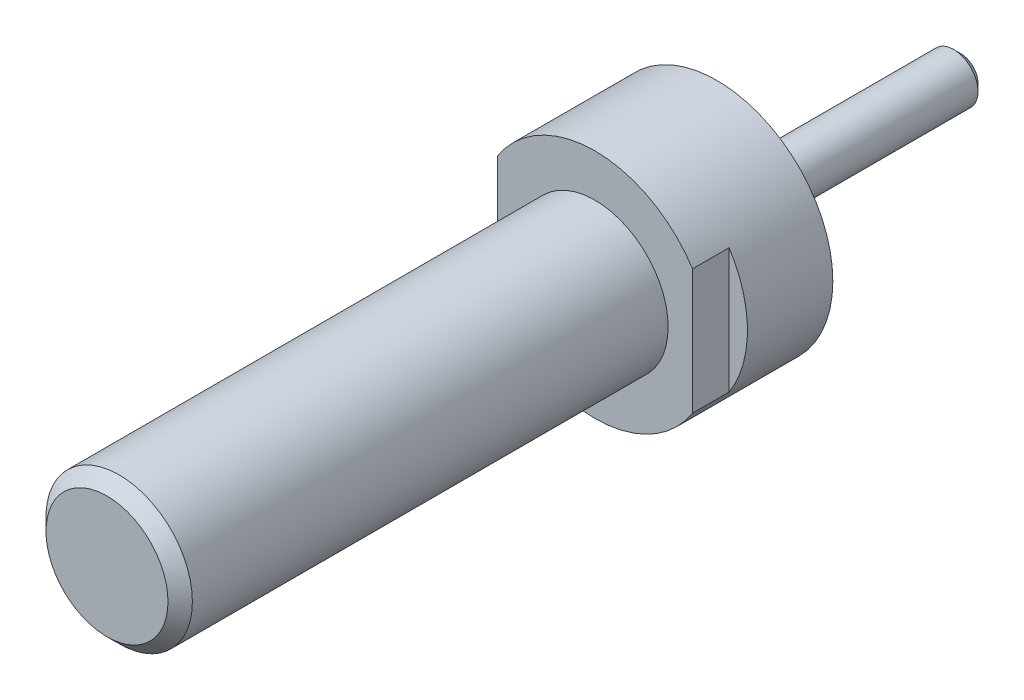
ISO-10303-21;
HEADER;
FILE_DESCRIPTION(('STEP AP214'),'2;1');
FILE_NAME('part.step','',(''),(''),'','','');
FILE_SCHEMA(('AUTOMOTIVE_DESIGN { 1 0 10303 214 1 1 1 1 }'));
ENDSEC;
DATA;
#1=APPLICATION_CONTEXT('core data for automotive mechanical design processes');
#2=APPLICATION_PROTOCOL_DEFINITION('international standard','automotive_design',2000,#1);
#3=PRODUCT_CONTEXT('',#1,'mechanical');
#4=PRODUCT('Part','Part','',(#3));
#5=PRODUCT_RELATED_PRODUCT_CATEGORY('part','',(#4));
#6=PRODUCT_DEFINITION_FORMATION('','',#4);
#7=PRODUCT_DEFINITION_CONTEXT('part definition',#1,'design');
#8=PRODUCT_DEFINITION('design','',#6,#7);
#9=PRODUCT_DEFINITION_SHAPE('','',#8);
#10=(LENGTH_UNIT() NAMED_UNIT(*) SI_UNIT(.MILLI.,.METRE.));
#11=(NAMED_UNIT(*) PLANE_ANGLE_UNIT() SI_UNIT($,.RADIAN.));
#12=(NAMED_UNIT(*) SI_UNIT($,.STERADIAN.) SOLID_ANGLE_UNIT());
#13=UNCERTAINTY_MEASURE_WITH_UNIT(LENGTH_MEASURE(1.E-05),#10,'distance_accuracy_value','');
#14=(GEOMETRIC_REPRESENTATION_CONTEXT(3) GLOBAL_UNCERTAINTY_ASSIGNED_CONTEXT((#13)) GLOBAL_UNIT_ASSIGNED_CONTEXT((#10,
#11,#12)) REPRESENTATION_CONTEXT('',''));
#15=CARTESIAN_POINT('',(0.,0.,0.));
#16=DIRECTION('',(0.,0.,1.));
#17=DIRECTION('',(1.,0.,0.));
#18=AXIS2_PLACEMENT_3D('',#15,#16,#17);
#19=CARTESIAN_POINT('',(0.,0.,15.));
#20=DIRECTION('',(0.,0.,1.));
#21=DIRECTION('',(1.,0.,0.));
#22=AXIS2_PLACEMENT_3D('',#19,#20,#21);
#23=PLANE('',#22);
#24=DIRECTION('',(0.,-1.,0.));
#25=VECTOR('',#24,1.);
#26=CARTESIAN_POINT('',(4.,0.,15.));
#27=LINE('',#26,#25);
#28=CARTESIAN_POINT('',(4.,2.5617376914899,15.));
#29=VERTEX_POINT('',#28);
#30=CARTESIAN_POINT('',(4.,-2.56173769148989,15.));
#31=VERTEX_POINT('',#30);
#32=EDGE_CURVE('E70',#29,#31,#27,.T.);
#33=ORIENTED_EDGE('',*,*,#32,.F.);
#34=CARTESIAN_POINT('',(0.,0.,15.));
#35=DIRECTION('',(0.,0.,1.));
#36=DIRECTION('',(1.,0.,0.));
#37=AXIS2_PLACEMENT_3D('',#34,#35,#36);
#38=CIRCLE('',#37,4.75);
#39=CARTESIAN_POINT('',(-4.,2.5617376914899,15.));
#40=VERTEX_POINT('',#39);
#41=EDGE_CURVE('E92',#29,#40,#38,.T.);
#42=ORIENTED_EDGE('',*,*,#41,.T.);
#43=DIRECTION('',(0.,1.,0.));
#44=VECTOR('',#43,1.);
#45=CARTESIAN_POINT('',(-4.,0.,15.));
#46=LINE('',#45,#44);
#47=CARTESIAN_POINT('',(-4.,-2.5617376914899,15.));
#48=VERTEX_POINT('',#47);
#49=EDGE_CURVE('E90',#48,#40,#46,.T.);
#50=ORIENTED_EDGE('',*,*,#49,.F.);
#51=EDGE_CURVE('E86',#48,#31,#38,.T.);
#52=ORIENTED_EDGE('',*,*,#51,.T.);
#53=EDGE_LOOP('',(#33,#42,#50,#52));
#54=FACE_BOUND('',#53,.T.);
#55=CARTESIAN_POINT('',(0.,0.,15.));
#56=DIRECTION('',(0.,0.,1.));
#57=DIRECTION('',(1.,0.,0.));
#58=AXIS2_PLACEMENT_3D('',#55,#56,#57);
#59=CIRCLE('',#58,3.);
#60=CARTESIAN_POINT('',(3.,0.,15.));
#61=VERTEX_POINT('',#60);
#62=EDGE_CURVE('E159',#61,#61,#59,.T.);
#63=ORIENTED_EDGE('',*,*,#62,.F.);
#64=EDGE_LOOP('',(#63));
#65=FACE_BOUND('',#64,.T.);
#66=ADVANCED_FACE('F29',(#54,#65),#23,.T.);
#67=CARTESIAN_POINT('',(0.,0.,9.99999999999999));
#68=DIRECTION('',(0.,0.,-1.));
#69=DIRECTION('',(-1.,0.,0.));
#70=AXIS2_PLACEMENT_3D('',#67,#68,#69);
#71=CYLINDRICAL_SURFACE('',#70,1.);
#72=CARTESIAN_POINT('',(0.,0.,0.299999999999995));
#73=DIRECTION('',(0.,0.,1.));
#74=DIRECTION('',(1.,0.,0.));
#75=AXIS2_PLACEMENT_3D('',#72,#73,#74);
#76=CIRCLE('',#75,1.);
#77=CARTESIAN_POINT('',(1.,0.,0.299999999999995));
#78=VERTEX_POINT('',#77);
#79=EDGE_CURVE('E37',#78,#78,#76,.T.);
#80=ORIENTED_EDGE('',*,*,#79,.T.);
#81=EDGE_LOOP('',(#80));
#82=FACE_BOUND('',#81,.T.);
#83=CARTESIAN_POINT('',(0.,0.,9.99999999999999));
#84=DIRECTION('',(0.,0.,1.));
#85=DIRECTION('',(1.,0.,0.));
#86=AXIS2_PLACEMENT_3D('',#83,#84,#85);
#87=CIRCLE('',#86,1.);
#88=CARTESIAN_POINT('',(1.,0.,9.99999999999999));
#89=VERTEX_POINT('',#88);
#90=EDGE_CURVE('E91',#89,#89,#87,.T.);
#91=ORIENTED_EDGE('',*,*,#90,.F.);
#92=EDGE_LOOP('',(#91));
#93=FACE_BOUND('',#92,.T.);
#94=ADVANCED_FACE('F31',(#82,#93),#71,.T.);
#95=CARTESIAN_POINT('',(0.,0.,0.));
#96=DIRECTION('',(0.,0.,1.));
#97=DIRECTION('',(1.,0.,0.));
#98=AXIS2_PLACEMENT_3D('',#95,#96,#97);
#99=PLANE('',#98);
#100=CARTESIAN_POINT('',(0.,0.,0.));
#101=DIRECTION('',(0.,0.,1.));
#102=DIRECTION('',(1.,0.,0.));
#103=AXIS2_PLACEMENT_3D('',#100,#101,#102);
#104=CIRCLE('',#103,0.699999999999999);
#105=CARTESIAN_POINT('',(0.699999999999999,0.,0.));
#106=VERTEX_POINT('',#105);
#107=EDGE_CURVE('E11',#106,#106,#104,.F.);
#108=ORIENTED_EDGE('',*,*,#107,.T.);
#109=EDGE_LOOP('',(#108));
#110=FACE_BOUND('',#109,.T.);
#111=ADVANCED_FACE('F130',(#110),#99,.F.);
#112=CARTESIAN_POINT('',(0.,0.,9.99999999999999));
#113=DIRECTION('',(0.,0.,1.));
#114=DIRECTION('',(1.,0.,0.));
#115=AXIS2_PLACEMENT_3D('',#112,#113,#114);
#116=PLANE('',#115);
#117=CARTESIAN_POINT('',(0.,0.,9.99999999999999));
#118=DIRECTION('',(0.,0.,1.));
#119=DIRECTION('',(1.,0.,0.));
#120=AXIS2_PLACEMENT_3D('',#117,#118,#119);
#121=CIRCLE('',#120,4.75);
#122=CARTESIAN_POINT('',(4.75,0.,9.99999999999999));
#123=VERTEX_POINT('',#122);
#124=EDGE_CURVE('E96',#123,#123,#121,.T.);
#125=ORIENTED_EDGE('',*,*,#124,.F.);
#126=EDGE_LOOP('',(#125));
#127=FACE_BOUND('',#126,.T.);
#128=ORIENTED_EDGE('',*,*,#90,.T.);
#129=EDGE_LOOP('',(#128));
#130=FACE_BOUND('',#129,.T.);
#131=ADVANCED_FACE('F133',(#127,#130),#116,.F.);
#132=CARTESIAN_POINT('',(0.,0.,15.));
#133=DIRECTION('',(0.,0.,-1.));
#134=DIRECTION('',(-1.,0.,0.));
#135=AXIS2_PLACEMENT_3D('',#132,#133,#134);
#136=CYLINDRICAL_SURFACE('',#135,4.75);
#137=ORIENTED_EDGE('',*,*,#41,.F.);
#138=DIRECTION('',(0.,0.,-1.));
#139=VECTOR('',#138,1.);
#140=CARTESIAN_POINT('',(4.,2.5617376914899,15.));
#141=LINE('',#140,#139);
#142=CARTESIAN_POINT('',(4.,2.5617376914899,13.5));
#143=VERTEX_POINT('',#142);
#144=EDGE_CURVE('E44',#29,#143,#141,.T.);
#145=ORIENTED_EDGE('',*,*,#144,.T.);
#146=CARTESIAN_POINT('',(0.,0.,13.5));
#147=DIRECTION('',(0.,0.,-1.));
#148=DIRECTION('',(-1.,0.,0.));
#149=AXIS2_PLACEMENT_3D('',#146,#147,#148);
#150=CIRCLE('',#149,4.75);
#151=CARTESIAN_POINT('',(4.,-2.56173769148989,13.5));
#152=VERTEX_POINT('',#151);
#153=EDGE_CURVE('E78',#143,#152,#150,.T.);
#154=ORIENTED_EDGE('',*,*,#153,.T.);
#155=DIRECTION('',(0.,0.,-1.));
#156=VECTOR('',#155,1.);
#157=CARTESIAN_POINT('',(4.,-2.56173769148989,15.));
#158=LINE('',#157,#156);
#159=EDGE_CURVE('E73',#152,#31,#158,.F.);
#160=ORIENTED_EDGE('',*,*,#159,.T.);
#161=ORIENTED_EDGE('',*,*,#51,.F.);
#162=DIRECTION('',(0.,0.,-1.));
#163=VECTOR('',#162,1.);
#164=CARTESIAN_POINT('',(-4.,-2.5617376914899,15.));
#165=LINE('',#164,#163);
#166=CARTESIAN_POINT('',(-4.,-2.5617376914899,13.5));
#167=VERTEX_POINT('',#166);
#168=EDGE_CURVE('E52',#48,#167,#165,.T.);
#169=ORIENTED_EDGE('',*,*,#168,.T.);
#170=CARTESIAN_POINT('',(0.,0.,13.5));
#171=DIRECTION('',(0.,0.,1.));
#172=DIRECTION('',(1.,0.,0.));
#173=AXIS2_PLACEMENT_3D('',#170,#171,#172);
#174=CIRCLE('',#173,4.75);
#175=CARTESIAN_POINT('',(-4.,2.5617376914899,13.5));
#176=VERTEX_POINT('',#175);
#177=EDGE_CURVE('E79',#176,#167,#174,.T.);
#178=ORIENTED_EDGE('',*,*,#177,.F.);
#179=DIRECTION('',(0.,0.,-1.));
#180=VECTOR('',#179,1.);
#181=CARTESIAN_POINT('',(-4.,2.5617376914899,15.));
#182=LINE('',#181,#180);
#183=EDGE_CURVE('E149',#176,#40,#182,.F.);
#184=ORIENTED_EDGE('',*,*,#183,.T.);
#185=EDGE_LOOP('',(#137,#145,#154,#160,#161,#169,#178,#184));
#186=FACE_BOUND('',#185,.T.);
#187=ORIENTED_EDGE('',*,*,#124,.T.);
#188=EDGE_LOOP('',(#187));
#189=FACE_BOUND('',#188,.T.);
#190=ADVANCED_FACE('F84',(#186,#189),#136,.T.);
#191=CARTESIAN_POINT('',(0.,0.,13.5));
#192=DIRECTION('',(0.,0.,1.));
#193=DIRECTION('',(1.,0.,0.));
#194=AXIS2_PLACEMENT_3D('',#191,#192,#193);
#195=PLANE('',#194);
#196=ORIENTED_EDGE('',*,*,#177,.T.);
#197=DIRECTION('',(0.,1.,0.));
#198=VECTOR('',#197,1.);
#199=CARTESIAN_POINT('',(-4.,3.64162068370398,13.5));
#200=LINE('',#199,#198);
#201=EDGE_CURVE('E152',#167,#176,#200,.T.);
#202=ORIENTED_EDGE('',*,*,#201,.T.);
#203=EDGE_LOOP('',(#196,#202));
#204=FACE_BOUND('',#203,.T.);
#205=ADVANCED_FACE('F136',(#204),#195,.T.);
#206=CARTESIAN_POINT('',(-4.,3.64162068370398,13.5));
#207=DIRECTION('',(1.,0.,0.));
#208=DIRECTION('',(0.,0.,-1.));
#209=AXIS2_PLACEMENT_3D('',#206,#207,#208);
#210=PLANE('',#209);
#211=ORIENTED_EDGE('',*,*,#49,.T.);
#212=ORIENTED_EDGE('',*,*,#183,.F.);
#213=ORIENTED_EDGE('',*,*,#201,.F.);
#214=ORIENTED_EDGE('',*,*,#168,.F.);
#215=EDGE_LOOP('',(#211,#212,#213,#214));
#216=FACE_BOUND('',#215,.T.);
#217=ADVANCED_FACE('F177',(#216),#210,.F.);
#218=CARTESIAN_POINT('',(4.,4.21877817019353,13.5));
#219=DIRECTION('',(0.,0.,-1.));
#220=DIRECTION('',(-1.,0.,0.));
#221=AXIS2_PLACEMENT_3D('',#218,#219,#220);
#222=PLANE('',#221);
#223=DIRECTION('',(0.,-1.,0.));
#224=VECTOR('',#223,1.);
#225=CARTESIAN_POINT('',(4.,4.21877817019353,13.5));
#226=LINE('',#225,#224);
#227=EDGE_CURVE('E87',#143,#152,#226,.T.);
#228=ORIENTED_EDGE('',*,*,#227,.T.);
#229=ORIENTED_EDGE('',*,*,#153,.F.);
#230=EDGE_LOOP('',(#228,#229));
#231=FACE_BOUND('',#230,.T.);
#232=ADVANCED_FACE('F173',(#231),#222,.F.);
#233=CARTESIAN_POINT('',(4.,4.21877817019353,13.5));
#234=DIRECTION('',(-1.,0.,0.));
#235=DIRECTION('',(0.,-1.,0.));
#236=AXIS2_PLACEMENT_3D('',#233,#234,#235);
#237=PLANE('',#236);
#238=ORIENTED_EDGE('',*,*,#32,.T.);
#239=ORIENTED_EDGE('',*,*,#159,.F.);
#240=ORIENTED_EDGE('',*,*,#227,.F.);
#241=ORIENTED_EDGE('',*,*,#144,.F.);
#242=EDGE_LOOP('',(#238,#239,#240,#241));
#243=FACE_BOUND('',#242,.T.);
#244=ADVANCED_FACE('F72',(#243),#237,.F.);
#245=CARTESIAN_POINT('',(0.,0.,35.));
#246=DIRECTION('',(0.,0.,-1.));
#247=DIRECTION('',(-1.,0.,0.));
#248=AXIS2_PLACEMENT_3D('',#245,#246,#247);
#249=CYLINDRICAL_SURFACE('',#248,3.);
#250=CARTESIAN_POINT('',(0.,0.,34.5));
#251=DIRECTION('',(0.,0.,1.));
#252=DIRECTION('',(1.,0.,0.));
#253=AXIS2_PLACEMENT_3D('',#250,#251,#252);
#254=CIRCLE('',#253,3.);
#255=CARTESIAN_POINT('',(3.,0.,34.5));
#256=VERTEX_POINT('',#255);
#257=EDGE_CURVE('E106',#256,#256,#254,.F.);
#258=ORIENTED_EDGE('',*,*,#257,.T.);
#259=EDGE_LOOP('',(#258));
#260=FACE_BOUND('',#259,.T.);
#261=ORIENTED_EDGE('',*,*,#62,.T.);
#262=EDGE_LOOP('',(#261));
#263=FACE_BOUND('',#262,.T.);
#264=ADVANCED_FACE('F163',(#260,#263),#249,.T.);
#265=CARTESIAN_POINT('',(0.,0.,35.));
#266=DIRECTION('',(0.,0.,1.));
#267=DIRECTION('',(1.,0.,0.));
#268=AXIS2_PLACEMENT_3D('',#265,#266,#267);
#269=PLANE('',#268);
#270=CARTESIAN_POINT('',(0.,0.,35.));
#271=DIRECTION('',(0.,0.,1.));
#272=DIRECTION('',(1.,0.,0.));
#273=AXIS2_PLACEMENT_3D('',#270,#271,#272);
#274=CIRCLE('',#273,2.5);
#275=CARTESIAN_POINT('',(2.5,0.,35.));
#276=VERTEX_POINT('',#275);
#277=EDGE_CURVE('E103',#276,#276,#274,.T.);
#278=ORIENTED_EDGE('',*,*,#277,.T.);
#279=EDGE_LOOP('',(#278));
#280=FACE_BOUND('',#279,.T.);
#281=ADVANCED_FACE('F121',(#280),#269,.T.);
#282=CARTESIAN_POINT('',(0.,0.,35.));
#283=DIRECTION('',(0.,0.,-1.));
#284=DIRECTION('',(-1.,0.,0.));
#285=AXIS2_PLACEMENT_3D('',#282,#283,#284);
#286=CONICAL_SURFACE('',#285,2.5,0.785398163397449);
#287=ORIENTED_EDGE('',*,*,#257,.F.);
#288=EDGE_LOOP('',(#287));
#289=FACE_BOUND('',#288,.T.);
#290=ORIENTED_EDGE('',*,*,#277,.F.);
#291=EDGE_LOOP('',(#290));
#292=FACE_BOUND('',#291,.T.);
#293=ADVANCED_FACE('F115',(#289,#292),#286,.T.);
#294=CARTESIAN_POINT('',(0.,0.,0.299999999999995));
#295=DIRECTION('',(0.,0.,1.));
#296=DIRECTION('',(1.,0.,0.));
#297=AXIS2_PLACEMENT_3D('',#294,#295,#296);
#298=CONICAL_SURFACE('',#297,1.,0.785398163397451);
#299=ORIENTED_EDGE('',*,*,#107,.F.);
#300=EDGE_LOOP('',(#299));
#301=FACE_BOUND('',#300,.T.);
#302=ORIENTED_EDGE('',*,*,#79,.F.);
#303=EDGE_LOOP('',(#302));
#304=FACE_BOUND('',#303,.T.);
#305=ADVANCED_FACE('F113',(#301,#304),#298,.T.);
#306=CLOSED_SHELL('',(#66,#94,#111,#131,#190,#205,#217,#232,#244,#264,#281,#293,#305));
#307=MANIFOLD_SOLID_BREP('B2',#306);
#308=ADVANCED_BREP_SHAPE_REPRESENTATION('',(#18,#307),#14);
#309=SHAPE_DEFINITION_REPRESENTATION(#9,#308);
ENDSEC;
END-ISO-10303-21;
